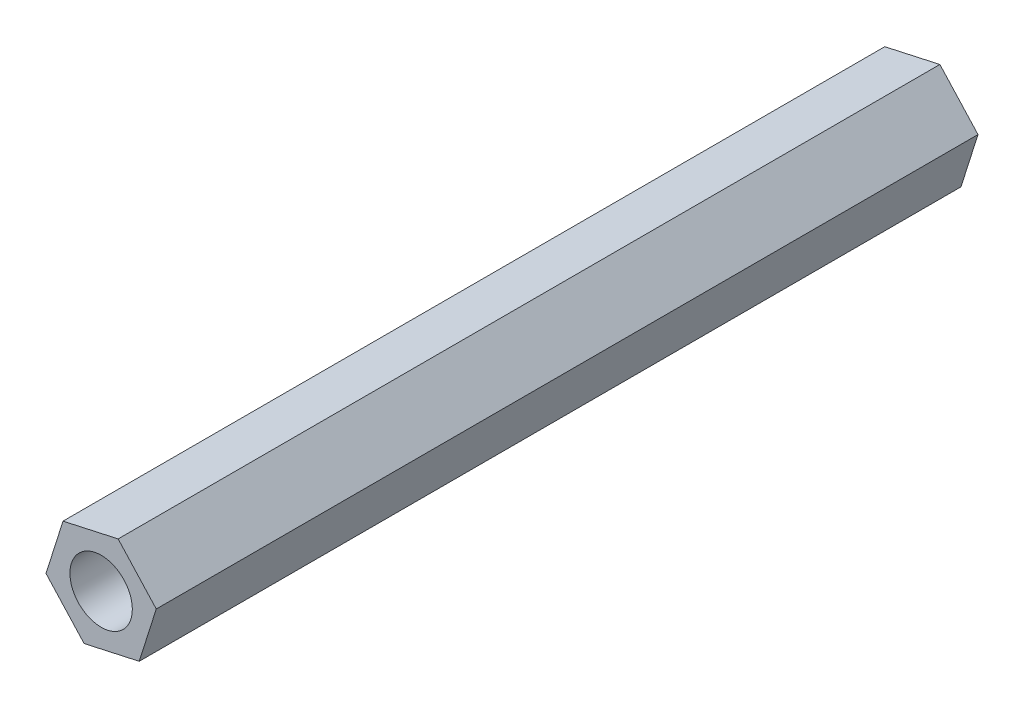
ISO-10303-21;
HEADER;
FILE_DESCRIPTION(('STEP AP214'),'2;1');
FILE_NAME('part.step','',(''),(''),'','','');
FILE_SCHEMA(('AUTOMOTIVE_DESIGN { 1 0 10303 214 1 1 1 1 }'));
ENDSEC;
DATA;
#1=APPLICATION_CONTEXT('core data for automotive mechanical design processes');
#2=APPLICATION_PROTOCOL_DEFINITION('international standard','automotive_design',2000,#1);
#3=PRODUCT_CONTEXT('',#1,'mechanical');
#4=PRODUCT('Part','Part','',(#3));
#5=PRODUCT_RELATED_PRODUCT_CATEGORY('part','',(#4));
#6=PRODUCT_DEFINITION_FORMATION('','',#4);
#7=PRODUCT_DEFINITION_CONTEXT('part definition',#1,'design');
#8=PRODUCT_DEFINITION('design','',#6,#7);
#9=PRODUCT_DEFINITION_SHAPE('','',#8);
#10=(LENGTH_UNIT() NAMED_UNIT(*) SI_UNIT(.MILLI.,.METRE.));
#11=(NAMED_UNIT(*) PLANE_ANGLE_UNIT() SI_UNIT($,.RADIAN.));
#12=(NAMED_UNIT(*) SI_UNIT($,.STERADIAN.) SOLID_ANGLE_UNIT());
#13=UNCERTAINTY_MEASURE_WITH_UNIT(LENGTH_MEASURE(1.E-05),#10,'distance_accuracy_value','');
#14=(GEOMETRIC_REPRESENTATION_CONTEXT(3) GLOBAL_UNCERTAINTY_ASSIGNED_CONTEXT((#13)) GLOBAL_UNIT_ASSIGNED_CONTEXT((#10,
#11,#12)) REPRESENTATION_CONTEXT('',''));
#15=CARTESIAN_POINT('',(0.,0.,0.));
#16=DIRECTION('',(0.,0.,1.));
#17=DIRECTION('',(1.,0.,0.));
#18=AXIS2_PLACEMENT_3D('',#15,#16,#17);
#19=CARTESIAN_POINT('',(0.,0.,39.5));
#20=DIRECTION('',(0.,0.,1.));
#21=DIRECTION('',(1.,0.,0.));
#22=AXIS2_PLACEMENT_3D('',#19,#20,#21);
#23=PLANE('',#22);
#24=DIRECTION('',(0.301648882780597,0.953419084934436,0.));
#25=VECTOR('',#24,1.);
#26=CARTESIAN_POINT('',(1.83126574996171,-2.00244827307736,39.5));
#27=LINE('',#26,#25);
#28=CARTESIAN_POINT('',(1.83126574996171,-2.00244827307736,39.5));
#29=VERTEX_POINT('',#28);
#30=CARTESIAN_POINT('',(2.64980394923012,0.584698524008543,39.5));
#31=VERTEX_POINT('',#30);
#32=EDGE_CURVE('E132',#29,#31,#27,.T.);
#33=ORIENTED_EDGE('',*,*,#32,.T.);
#34=DIRECTION('',(-0.674860706615837,0.737945137978409,0.));
#35=VECTOR('',#34,1.);
#36=CARTESIAN_POINT('',(2.64980394923012,0.584698524008543,39.5));
#37=LINE('',#36,#35);
#38=CARTESIAN_POINT('',(0.818538199268401,2.58714679708588,39.5));
#39=VERTEX_POINT('',#38);
#40=EDGE_CURVE('E90',#31,#39,#37,.T.);
#41=ORIENTED_EDGE('',*,*,#40,.T.);
#42=DIRECTION('',(-0.976509589396434,-0.215473946956026,0.));
#43=VECTOR('',#42,1.);
#44=CARTESIAN_POINT('',(0.818538199268401,2.58714679708588,39.5));
#45=LINE('',#44,#43);
#46=CARTESIAN_POINT('',(-1.8312657499617,2.00244827307734,39.5));
#47=VERTEX_POINT('',#46);
#48=EDGE_CURVE('E103',#39,#47,#45,.T.);
#49=ORIENTED_EDGE('',*,*,#48,.T.);
#50=DIRECTION('',(-0.301648882780597,-0.953419084934436,0.));
#51=VECTOR('',#50,1.);
#52=CARTESIAN_POINT('',(-1.8312657499617,2.00244827307734,39.5));
#53=LINE('',#52,#51);
#54=CARTESIAN_POINT('',(-2.6498039492301,-0.584698524008529,39.5));
#55=VERTEX_POINT('',#54);
#56=EDGE_CURVE('E97',#47,#55,#53,.T.);
#57=ORIENTED_EDGE('',*,*,#56,.T.);
#58=DIRECTION('',(0.674860706615837,-0.737945137978409,0.));
#59=VECTOR('',#58,1.);
#60=CARTESIAN_POINT('',(-2.6498039492301,-0.584698524008529,39.5));
#61=LINE('',#60,#59);
#62=CARTESIAN_POINT('',(-0.818538199268357,-2.58714679708589,39.5));
#63=VERTEX_POINT('',#62);
#64=EDGE_CURVE('E101',#55,#63,#61,.T.);
#65=ORIENTED_EDGE('',*,*,#64,.T.);
#66=DIRECTION('',(0.976509589396434,0.215473946956027,0.));
#67=VECTOR('',#66,1.);
#68=CARTESIAN_POINT('',(-0.818538199268357,-2.58714679708589,39.5));
#69=LINE('',#68,#67);
#70=EDGE_CURVE('E53',#63,#29,#69,.T.);
#71=ORIENTED_EDGE('',*,*,#70,.T.);
#72=EDGE_LOOP('',(#33,#41,#49,#57,#65,#71));
#73=FACE_BOUND('',#72,.T.);
#74=CARTESIAN_POINT('',(0.,0.,39.5));
#75=DIRECTION('',(0.,0.,1.));
#76=DIRECTION('',(1.,0.,0.));
#77=AXIS2_PLACEMENT_3D('',#74,#75,#76);
#78=CIRCLE('',#77,1.5);
#79=CARTESIAN_POINT('',(1.5,0.,39.5));
#80=VERTEX_POINT('',#79);
#81=EDGE_CURVE('E125',#80,#80,#78,.T.);
#82=ORIENTED_EDGE('',*,*,#81,.F.);
#83=EDGE_LOOP('',(#82));
#84=FACE_BOUND('',#83,.T.);
#85=ADVANCED_FACE('F36',(#73,#84),#23,.T.);
#86=CARTESIAN_POINT('',(0.,0.,0.));
#87=DIRECTION('',(0.,0.,1.));
#88=DIRECTION('',(1.,0.,0.));
#89=AXIS2_PLACEMENT_3D('',#86,#87,#88);
#90=PLANE('',#89);
#91=DIRECTION('',(0.301648882780597,0.953419084934436,0.));
#92=VECTOR('',#91,1.);
#93=CARTESIAN_POINT('',(1.83126574996171,-2.00244827307736,0.));
#94=LINE('',#93,#92);
#95=CARTESIAN_POINT('',(1.83126574996171,-2.00244827307736,0.));
#96=VERTEX_POINT('',#95);
#97=CARTESIAN_POINT('',(2.64980394923012,0.584698524008543,0.));
#98=VERTEX_POINT('',#97);
#99=EDGE_CURVE('E121',#96,#98,#94,.T.);
#100=ORIENTED_EDGE('',*,*,#99,.F.);
#101=DIRECTION('',(0.976509589396434,0.215473946956027,0.));
#102=VECTOR('',#101,1.);
#103=CARTESIAN_POINT('',(-0.818538199268357,-2.58714679708589,0.));
#104=LINE('',#103,#102);
#105=CARTESIAN_POINT('',(-0.818538199268357,-2.58714679708589,0.));
#106=VERTEX_POINT('',#105);
#107=EDGE_CURVE('E82',#106,#96,#104,.T.);
#108=ORIENTED_EDGE('',*,*,#107,.F.);
#109=DIRECTION('',(0.674860706615837,-0.737945137978409,0.));
#110=VECTOR('',#109,1.);
#111=CARTESIAN_POINT('',(-2.6498039492301,-0.584698524008529,0.));
#112=LINE('',#111,#110);
#113=CARTESIAN_POINT('',(-2.6498039492301,-0.584698524008529,0.));
#114=VERTEX_POINT('',#113);
#115=EDGE_CURVE('E76',#114,#106,#112,.T.);
#116=ORIENTED_EDGE('',*,*,#115,.F.);
#117=DIRECTION('',(-0.301648882780597,-0.953419084934436,0.));
#118=VECTOR('',#117,1.);
#119=CARTESIAN_POINT('',(-1.8312657499617,2.00244827307734,0.));
#120=LINE('',#119,#118);
#121=CARTESIAN_POINT('',(-1.8312657499617,2.00244827307734,0.));
#122=VERTEX_POINT('',#121);
#123=EDGE_CURVE('E111',#122,#114,#120,.T.);
#124=ORIENTED_EDGE('',*,*,#123,.F.);
#125=DIRECTION('',(-0.976509589396434,-0.215473946956026,0.));
#126=VECTOR('',#125,1.);
#127=CARTESIAN_POINT('',(0.818538199268401,2.58714679708588,0.));
#128=LINE('',#127,#126);
#129=CARTESIAN_POINT('',(0.818538199268401,2.58714679708588,0.));
#130=VERTEX_POINT('',#129);
#131=EDGE_CURVE('E127',#130,#122,#128,.T.);
#132=ORIENTED_EDGE('',*,*,#131,.F.);
#133=DIRECTION('',(-0.674860706615837,0.737945137978409,0.));
#134=VECTOR('',#133,1.);
#135=CARTESIAN_POINT('',(2.64980394923012,0.584698524008543,0.));
#136=LINE('',#135,#134);
#137=EDGE_CURVE('E124',#98,#130,#136,.T.);
#138=ORIENTED_EDGE('',*,*,#137,.F.);
#139=EDGE_LOOP('',(#100,#108,#116,#124,#132,#138));
#140=FACE_BOUND('',#139,.T.);
#141=CARTESIAN_POINT('',(0.,0.,0.));
#142=DIRECTION('',(0.,0.,1.));
#143=DIRECTION('',(1.,0.,0.));
#144=AXIS2_PLACEMENT_3D('',#141,#142,#143);
#145=CIRCLE('',#144,1.5);
#146=CARTESIAN_POINT('',(1.5,0.,0.));
#147=VERTEX_POINT('',#146);
#148=EDGE_CURVE('E225',#147,#147,#145,.T.);
#149=ORIENTED_EDGE('',*,*,#148,.T.);
#150=EDGE_LOOP('',(#149));
#151=FACE_BOUND('',#150,.T.);
#152=ADVANCED_FACE('F141',(#140,#151),#90,.F.);
#153=CARTESIAN_POINT('',(1.83126574996171,-2.00244827307736,39.5));
#154=DIRECTION('',(-0.953419084934436,0.301648882780597,0.));
#155=DIRECTION('',(-0.301648882780597,-0.953419084934436,0.));
#156=AXIS2_PLACEMENT_3D('',#153,#154,#155);
#157=PLANE('',#156);
#158=ORIENTED_EDGE('',*,*,#99,.T.);
#159=DIRECTION('',(0.,0.,-1.));
#160=VECTOR('',#159,1.);
#161=CARTESIAN_POINT('',(2.64980394923012,0.584698524008543,39.5));
#162=LINE('',#161,#160);
#163=EDGE_CURVE('E11',#31,#98,#162,.T.);
#164=ORIENTED_EDGE('',*,*,#163,.F.);
#165=ORIENTED_EDGE('',*,*,#32,.F.);
#166=DIRECTION('',(0.,0.,-1.));
#167=VECTOR('',#166,1.);
#168=CARTESIAN_POINT('',(1.83126574996171,-2.00244827307736,39.5));
#169=LINE('',#168,#167);
#170=EDGE_CURVE('E117',#29,#96,#169,.T.);
#171=ORIENTED_EDGE('',*,*,#170,.T.);
#172=EDGE_LOOP('',(#158,#164,#165,#171));
#173=FACE_BOUND('',#172,.T.);
#174=ADVANCED_FACE('F38',(#173),#157,.F.);
#175=CARTESIAN_POINT('',(2.64980394923012,0.584698524008543,39.5));
#176=DIRECTION('',(-0.737945137978409,-0.674860706615837,0.));
#177=DIRECTION('',(0.674860706615837,-0.737945137978409,0.));
#178=AXIS2_PLACEMENT_3D('',#175,#176,#177);
#179=PLANE('',#178);
#180=ORIENTED_EDGE('',*,*,#137,.T.);
#181=DIRECTION('',(0.,0.,-1.));
#182=VECTOR('',#181,1.);
#183=CARTESIAN_POINT('',(0.818538199268401,2.58714679708588,39.5));
#184=LINE('',#183,#182);
#185=EDGE_CURVE('E45',#39,#130,#184,.T.);
#186=ORIENTED_EDGE('',*,*,#185,.F.);
#187=ORIENTED_EDGE('',*,*,#40,.F.);
#188=ORIENTED_EDGE('',*,*,#163,.T.);
#189=EDGE_LOOP('',(#180,#186,#187,#188));
#190=FACE_BOUND('',#189,.T.);
#191=ADVANCED_FACE('F166',(#190),#179,.F.);
#192=CARTESIAN_POINT('',(0.818538199268401,2.58714679708588,39.5));
#193=DIRECTION('',(0.215473946956026,-0.976509589396434,0.));
#194=DIRECTION('',(0.976509589396434,0.215473946956026,0.));
#195=AXIS2_PLACEMENT_3D('',#192,#193,#194);
#196=PLANE('',#195);
#197=ORIENTED_EDGE('',*,*,#131,.T.);
#198=DIRECTION('',(0.,0.,-1.));
#199=VECTOR('',#198,1.);
#200=CARTESIAN_POINT('',(-1.8312657499617,2.00244827307734,39.5));
#201=LINE('',#200,#199);
#202=EDGE_CURVE('E112',#47,#122,#201,.T.);
#203=ORIENTED_EDGE('',*,*,#202,.F.);
#204=ORIENTED_EDGE('',*,*,#48,.F.);
#205=ORIENTED_EDGE('',*,*,#185,.T.);
#206=EDGE_LOOP('',(#197,#203,#204,#205));
#207=FACE_BOUND('',#206,.T.);
#208=ADVANCED_FACE('F138',(#207),#196,.F.);
#209=CARTESIAN_POINT('',(-1.8312657499617,2.00244827307734,39.5));
#210=DIRECTION('',(0.953419084934436,-0.301648882780597,0.));
#211=DIRECTION('',(0.301648882780597,0.953419084934436,0.));
#212=AXIS2_PLACEMENT_3D('',#209,#210,#211);
#213=PLANE('',#212);
#214=ORIENTED_EDGE('',*,*,#123,.T.);
#215=DIRECTION('',(0.,0.,-1.));
#216=VECTOR('',#215,1.);
#217=CARTESIAN_POINT('',(-2.6498039492301,-0.584698524008529,39.5));
#218=LINE('',#217,#216);
#219=EDGE_CURVE('E108',#55,#114,#218,.T.);
#220=ORIENTED_EDGE('',*,*,#219,.F.);
#221=ORIENTED_EDGE('',*,*,#56,.F.);
#222=ORIENTED_EDGE('',*,*,#202,.T.);
#223=EDGE_LOOP('',(#214,#220,#221,#222));
#224=FACE_BOUND('',#223,.T.);
#225=ADVANCED_FACE('F109',(#224),#213,.F.);
#226=CARTESIAN_POINT('',(-2.6498039492301,-0.584698524008529,39.5));
#227=DIRECTION('',(0.737945137978409,0.674860706615837,0.));
#228=DIRECTION('',(-0.674860706615837,0.737945137978409,0.));
#229=AXIS2_PLACEMENT_3D('',#226,#227,#228);
#230=PLANE('',#229);
#231=ORIENTED_EDGE('',*,*,#115,.T.);
#232=DIRECTION('',(0.,0.,-1.));
#233=VECTOR('',#232,1.);
#234=CARTESIAN_POINT('',(-0.818538199268357,-2.58714679708589,39.5));
#235=LINE('',#234,#233);
#236=EDGE_CURVE('E113',#63,#106,#235,.T.);
#237=ORIENTED_EDGE('',*,*,#236,.F.);
#238=ORIENTED_EDGE('',*,*,#64,.F.);
#239=ORIENTED_EDGE('',*,*,#219,.T.);
#240=EDGE_LOOP('',(#231,#237,#238,#239));
#241=FACE_BOUND('',#240,.T.);
#242=ADVANCED_FACE('F115',(#241),#230,.F.);
#243=CARTESIAN_POINT('',(-0.818538199268357,-2.58714679708589,39.5));
#244=DIRECTION('',(-0.215473946956026,0.976509589396434,0.));
#245=DIRECTION('',(-0.976509589396434,-0.215473946956027,0.));
#246=AXIS2_PLACEMENT_3D('',#243,#244,#245);
#247=PLANE('',#246);
#248=ORIENTED_EDGE('',*,*,#107,.T.);
#249=ORIENTED_EDGE('',*,*,#170,.F.);
#250=ORIENTED_EDGE('',*,*,#70,.F.);
#251=ORIENTED_EDGE('',*,*,#236,.T.);
#252=EDGE_LOOP('',(#248,#249,#250,#251));
#253=FACE_BOUND('',#252,.T.);
#254=ADVANCED_FACE('F146',(#253),#247,.F.);
#255=CARTESIAN_POINT('',(0.,0.,39.5));
#256=DIRECTION('',(0.,0.,-1.));
#257=DIRECTION('',(-1.,0.,0.));
#258=AXIS2_PLACEMENT_3D('',#255,#256,#257);
#259=CYLINDRICAL_SURFACE('',#258,1.5);
#260=ORIENTED_EDGE('',*,*,#81,.T.);
#261=EDGE_LOOP('',(#260));
#262=FACE_BOUND('',#261,.T.);
#263=ORIENTED_EDGE('',*,*,#148,.F.);
#264=EDGE_LOOP('',(#263));
#265=FACE_BOUND('',#264,.T.);
#266=ADVANCED_FACE('F148',(#262,#265),#259,.F.);
#267=CLOSED_SHELL('',(#85,#152,#174,#191,#208,#225,#242,#254,#266));
#268=MANIFOLD_SOLID_BREP('B2',#267);
#269=ADVANCED_BREP_SHAPE_REPRESENTATION('',(#18,#268),#14);
#270=SHAPE_DEFINITION_REPRESENTATION(#9,#269);
ENDSEC;
END-ISO-10303-21;
